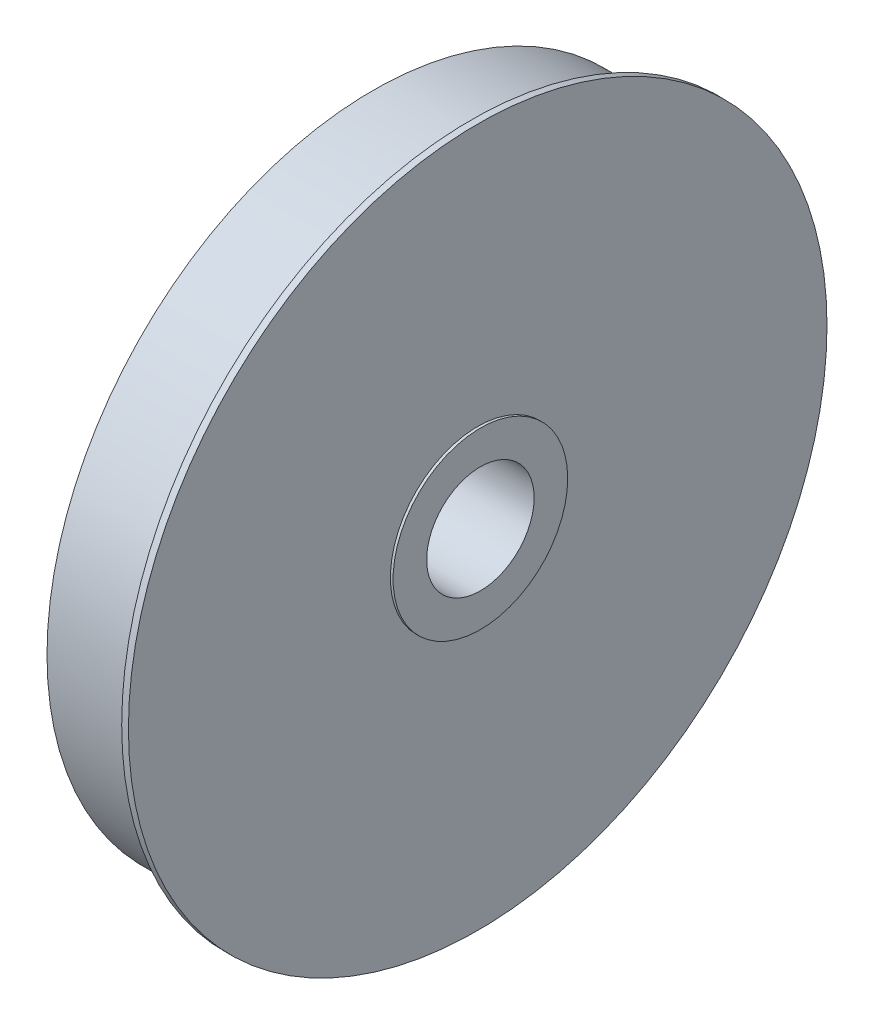
ISO-10303-21;
HEADER;
FILE_DESCRIPTION(('STEP AP214'),'2;1');
FILE_NAME('part.step','',(''),(''),'','','');
FILE_SCHEMA(('AUTOMOTIVE_DESIGN { 1 0 10303 214 1 1 1 1 }'));
ENDSEC;
DATA;
#1=APPLICATION_CONTEXT('core data for automotive mechanical design processes');
#2=APPLICATION_PROTOCOL_DEFINITION('international standard','automotive_design',2000,#1);
#3=PRODUCT_CONTEXT('',#1,'mechanical');
#4=PRODUCT('Part','Part','',(#3));
#5=PRODUCT_RELATED_PRODUCT_CATEGORY('part','',(#4));
#6=PRODUCT_DEFINITION_FORMATION('','',#4);
#7=PRODUCT_DEFINITION_CONTEXT('part definition',#1,'design');
#8=PRODUCT_DEFINITION('design','',#6,#7);
#9=PRODUCT_DEFINITION_SHAPE('','',#8);
#10=(LENGTH_UNIT() NAMED_UNIT(*) SI_UNIT(.MILLI.,.METRE.));
#11=(NAMED_UNIT(*) PLANE_ANGLE_UNIT() SI_UNIT($,.RADIAN.));
#12=(NAMED_UNIT(*) SI_UNIT($,.STERADIAN.) SOLID_ANGLE_UNIT());
#13=UNCERTAINTY_MEASURE_WITH_UNIT(LENGTH_MEASURE(1.E-05),#10,'distance_accuracy_value','');
#14=(GEOMETRIC_REPRESENTATION_CONTEXT(3) GLOBAL_UNCERTAINTY_ASSIGNED_CONTEXT((#13)) GLOBAL_UNIT_ASSIGNED_CONTEXT((#10,
#11,#12)) REPRESENTATION_CONTEXT('',''));
#15=CARTESIAN_POINT('',(0.,0.,0.));
#16=DIRECTION('',(0.,0.,1.));
#17=DIRECTION('',(1.,0.,0.));
#18=AXIS2_PLACEMENT_3D('',#15,#16,#17);
#19=CARTESIAN_POINT('',(8.8,26.,0.));
#20=DIRECTION('',(1.,0.,0.));
#21=DIRECTION('',(0.,0.,-1.));
#22=AXIS2_PLACEMENT_3D('',#19,#20,#21);
#23=PLANE('',#22);
#24=CARTESIAN_POINT('',(8.8,0.,0.));
#25=DIRECTION('',(1.,0.,0.));
#26=DIRECTION('',(0.,0.,-1.));
#27=AXIS2_PLACEMENT_3D('',#24,#25,#26);
#28=CIRCLE('',#27,6.5);
#29=CARTESIAN_POINT('',(8.8,0.,-6.5));
#30=VERTEX_POINT('',#29);
#31=EDGE_CURVE('E10',#30,#30,#28,.T.);
#32=ORIENTED_EDGE('',*,*,#31,.F.);
#33=EDGE_LOOP('',(#32));
#34=FACE_BOUND('',#33,.T.);
#35=CARTESIAN_POINT('',(8.8,0.,0.));
#36=DIRECTION('',(-1.,0.,0.));
#37=DIRECTION('',(0.,0.,1.));
#38=AXIS2_PLACEMENT_3D('',#35,#36,#37);
#39=CIRCLE('',#38,26.);
#40=CARTESIAN_POINT('',(8.8,0.,26.));
#41=VERTEX_POINT('',#40);
#42=EDGE_CURVE('E37',#41,#41,#39,.T.);
#43=ORIENTED_EDGE('',*,*,#42,.F.);
#44=EDGE_LOOP('',(#43));
#45=FACE_BOUND('',#44,.T.);
#46=ADVANCED_FACE('F33',(#34,#45),#23,.T.);
#47=CARTESIAN_POINT('',(0.,0.,0.));
#48=DIRECTION('',(-1.,0.,0.));
#49=DIRECTION('',(0.,0.,1.));
#50=AXIS2_PLACEMENT_3D('',#47,#48,#49);
#51=PLANE('',#50);
#52=CARTESIAN_POINT('',(0.,0.,0.));
#53=DIRECTION('',(-1.,0.,0.));
#54=DIRECTION('',(0.,0.,1.));
#55=AXIS2_PLACEMENT_3D('',#52,#53,#54);
#56=CIRCLE('',#55,20.);
#57=CARTESIAN_POINT('',(0.,0.,20.));
#58=VERTEX_POINT('',#57);
#59=EDGE_CURVE('E55',#58,#58,#56,.T.);
#60=ORIENTED_EDGE('',*,*,#59,.T.);
#61=EDGE_LOOP('',(#60));
#62=FACE_BOUND('',#61,.T.);
#63=CARTESIAN_POINT('',(0.,0.,0.));
#64=DIRECTION('',(1.,0.,0.));
#65=DIRECTION('',(0.,0.,-1.));
#66=AXIS2_PLACEMENT_3D('',#63,#64,#65);
#67=CIRCLE('',#66,3.99999999999999);
#68=CARTESIAN_POINT('',(0.,0.,-3.99999999999999));
#69=VERTEX_POINT('',#68);
#70=EDGE_CURVE('E52',#69,#69,#67,.T.);
#71=ORIENTED_EDGE('',*,*,#70,.T.);
#72=EDGE_LOOP('',(#71));
#73=FACE_BOUND('',#72,.T.);
#74=ADVANCED_FACE('F35',(#62,#73),#51,.T.);
#75=CARTESIAN_POINT('',(-7.95616019814424,0.,0.));
#76=DIRECTION('',(-1.,0.,0.));
#77=DIRECTION('',(0.,0.,1.));
#78=AXIS2_PLACEMENT_3D('',#75,#76,#77);
#79=CYLINDRICAL_SURFACE('',#78,26.);
#80=CARTESIAN_POINT('',(8.3,0.,0.));
#81=DIRECTION('',(-1.,0.,0.));
#82=DIRECTION('',(0.,0.,1.));
#83=AXIS2_PLACEMENT_3D('',#80,#81,#82);
#84=CIRCLE('',#83,26.);
#85=CARTESIAN_POINT('',(8.3,0.,26.));
#86=VERTEX_POINT('',#85);
#87=EDGE_CURVE('E45',#86,#86,#84,.T.);
#88=ORIENTED_EDGE('',*,*,#87,.F.);
#89=EDGE_LOOP('',(#88));
#90=FACE_BOUND('',#89,.T.);
#91=ORIENTED_EDGE('',*,*,#42,.T.);
#92=EDGE_LOOP('',(#91));
#93=FACE_BOUND('',#92,.T.);
#94=ADVANCED_FACE('F75',(#90,#93),#79,.T.);
#95=CARTESIAN_POINT('',(7.8,0.,0.));
#96=DIRECTION('',(1.,0.,0.));
#97=DIRECTION('',(0.,0.,-1.));
#98=AXIS2_PLACEMENT_3D('',#95,#96,#97);
#99=CONICAL_SURFACE('',#98,25.1339745962156,1.0471975511966);
#100=ORIENTED_EDGE('',*,*,#87,.T.);
#101=EDGE_LOOP('',(#100));
#102=FACE_BOUND('',#101,.T.);
#103=CARTESIAN_POINT('',(7.8,0.,0.));
#104=DIRECTION('',(-1.,0.,0.));
#105=DIRECTION('',(0.,0.,1.));
#106=AXIS2_PLACEMENT_3D('',#103,#104,#105);
#107=CIRCLE('',#106,25.1339745962156);
#108=CARTESIAN_POINT('',(7.8,0.,25.1339745962156));
#109=VERTEX_POINT('',#108);
#110=EDGE_CURVE('E67',#109,#109,#107,.T.);
#111=ORIENTED_EDGE('',*,*,#110,.F.);
#112=EDGE_LOOP('',(#111));
#113=FACE_BOUND('',#112,.T.);
#114=ADVANCED_FACE('F72',(#102,#113),#99,.T.);
#115=CARTESIAN_POINT('',(7.8,24.26,0.));
#116=DIRECTION('',(-1.,0.,0.));
#117=DIRECTION('',(0.,0.,1.));
#118=AXIS2_PLACEMENT_3D('',#115,#116,#117);
#119=PLANE('',#118);
#120=ORIENTED_EDGE('',*,*,#110,.T.);
#121=EDGE_LOOP('',(#120));
#122=FACE_BOUND('',#121,.T.);
#123=CARTESIAN_POINT('',(7.8,0.,0.));
#124=DIRECTION('',(-1.,0.,0.));
#125=DIRECTION('',(0.,0.,1.));
#126=AXIS2_PLACEMENT_3D('',#123,#124,#125);
#127=CIRCLE('',#126,24.26);
#128=CARTESIAN_POINT('',(7.8,0.,24.26));
#129=VERTEX_POINT('',#128);
#130=EDGE_CURVE('E64',#129,#129,#127,.T.);
#131=ORIENTED_EDGE('',*,*,#130,.F.);
#132=EDGE_LOOP('',(#131));
#133=FACE_BOUND('',#132,.T.);
#134=ADVANCED_FACE('F90',(#122,#133),#119,.T.);
#135=CARTESIAN_POINT('',(-7.95616019814424,0.,0.));
#136=DIRECTION('',(-1.,0.,0.));
#137=DIRECTION('',(0.,0.,1.));
#138=AXIS2_PLACEMENT_3D('',#135,#136,#137);
#139=CYLINDRICAL_SURFACE('',#138,24.26);
#140=CARTESIAN_POINT('',(1.,0.,0.));
#141=DIRECTION('',(-1.,0.,0.));
#142=DIRECTION('',(0.,0.,1.));
#143=AXIS2_PLACEMENT_3D('',#140,#141,#142);
#144=CIRCLE('',#143,24.26);
#145=CARTESIAN_POINT('',(1.,0.,24.26));
#146=VERTEX_POINT('',#145);
#147=EDGE_CURVE('E61',#146,#146,#144,.T.);
#148=ORIENTED_EDGE('',*,*,#147,.F.);
#149=EDGE_LOOP('',(#148));
#150=FACE_BOUND('',#149,.T.);
#151=ORIENTED_EDGE('',*,*,#130,.T.);
#152=EDGE_LOOP('',(#151));
#153=FACE_BOUND('',#152,.T.);
#154=ADVANCED_FACE('F93',(#150,#153),#139,.T.);
#155=CARTESIAN_POINT('',(1.,20.,0.));
#156=DIRECTION('',(-1.,0.,0.));
#157=DIRECTION('',(0.,0.,1.));
#158=AXIS2_PLACEMENT_3D('',#155,#156,#157);
#159=PLANE('',#158);
#160=ORIENTED_EDGE('',*,*,#147,.T.);
#161=EDGE_LOOP('',(#160));
#162=FACE_BOUND('',#161,.T.);
#163=CARTESIAN_POINT('',(1.,0.,0.));
#164=DIRECTION('',(-1.,0.,0.));
#165=DIRECTION('',(0.,0.,1.));
#166=AXIS2_PLACEMENT_3D('',#163,#164,#165);
#167=CIRCLE('',#166,20.);
#168=CARTESIAN_POINT('',(1.,0.,20.));
#169=VERTEX_POINT('',#168);
#170=EDGE_CURVE('E58',#169,#169,#167,.T.);
#171=ORIENTED_EDGE('',*,*,#170,.F.);
#172=EDGE_LOOP('',(#171));
#173=FACE_BOUND('',#172,.T.);
#174=ADVANCED_FACE('F97',(#162,#173),#159,.T.);
#175=CARTESIAN_POINT('',(-7.95616019814424,0.,0.));
#176=DIRECTION('',(-1.,0.,0.));
#177=DIRECTION('',(0.,0.,1.));
#178=AXIS2_PLACEMENT_3D('',#175,#176,#177);
#179=CYLINDRICAL_SURFACE('',#178,20.);
#180=ORIENTED_EDGE('',*,*,#59,.F.);
#181=EDGE_LOOP('',(#180));
#182=FACE_BOUND('',#181,.T.);
#183=ORIENTED_EDGE('',*,*,#170,.T.);
#184=EDGE_LOOP('',(#183));
#185=FACE_BOUND('',#184,.T.);
#186=ADVANCED_FACE('F101',(#182,#185),#179,.T.);
#187=CARTESIAN_POINT('',(8.8,0.,0.));
#188=DIRECTION('',(1.,0.,0.));
#189=DIRECTION('',(0.,0.,-1.));
#190=AXIS2_PLACEMENT_3D('',#187,#188,#189);
#191=CYLINDRICAL_SURFACE('',#190,3.99999999999999);
#192=ORIENTED_EDGE('',*,*,#70,.F.);
#193=EDGE_LOOP('',(#192));
#194=FACE_BOUND('',#193,.T.);
#195=CARTESIAN_POINT('',(9.,0.,0.));
#196=DIRECTION('',(1.,0.,0.));
#197=DIRECTION('',(0.,0.,-1.));
#198=AXIS2_PLACEMENT_3D('',#195,#196,#197);
#199=CIRCLE('',#198,3.99999999999999);
#200=CARTESIAN_POINT('',(9.,0.,-3.99999999999999));
#201=VERTEX_POINT('',#200);
#202=EDGE_CURVE('E48',#201,#201,#199,.T.);
#203=ORIENTED_EDGE('',*,*,#202,.T.);
#204=EDGE_LOOP('',(#203));
#205=FACE_BOUND('',#204,.T.);
#206=ADVANCED_FACE('F105',(#194,#205),#191,.F.);
#207=CARTESIAN_POINT('',(9.,0.,0.));
#208=DIRECTION('',(1.,0.,0.));
#209=DIRECTION('',(0.,0.,-1.));
#210=AXIS2_PLACEMENT_3D('',#207,#208,#209);
#211=PLANE('',#210);
#212=CARTESIAN_POINT('',(9.,0.,0.));
#213=DIRECTION('',(1.,0.,0.));
#214=DIRECTION('',(0.,0.,-1.));
#215=AXIS2_PLACEMENT_3D('',#212,#213,#214);
#216=CIRCLE('',#215,6.5);
#217=CARTESIAN_POINT('',(9.,0.,-6.5));
#218=VERTEX_POINT('',#217);
#219=EDGE_CURVE('E49',#218,#218,#216,.T.);
#220=ORIENTED_EDGE('',*,*,#219,.T.);
#221=EDGE_LOOP('',(#220));
#222=FACE_BOUND('',#221,.T.);
#223=ORIENTED_EDGE('',*,*,#202,.F.);
#224=EDGE_LOOP('',(#223));
#225=FACE_BOUND('',#224,.T.);
#226=ADVANCED_FACE('F109',(#222,#225),#211,.T.);
#227=CARTESIAN_POINT('',(9.,0.,0.));
#228=DIRECTION('',(-1.,0.,0.));
#229=DIRECTION('',(0.,0.,1.));
#230=AXIS2_PLACEMENT_3D('',#227,#228,#229);
#231=CYLINDRICAL_SURFACE('',#230,6.5);
#232=ORIENTED_EDGE('',*,*,#219,.F.);
#233=EDGE_LOOP('',(#232));
#234=FACE_BOUND('',#233,.T.);
#235=ORIENTED_EDGE('',*,*,#31,.T.);
#236=EDGE_LOOP('',(#235));
#237=FACE_BOUND('',#236,.T.);
#238=ADVANCED_FACE('F111',(#234,#237),#231,.T.);
#239=CLOSED_SHELL('',(#46,#74,#94,#114,#134,#154,#174,#186,#206,#226,#238));
#240=MANIFOLD_SOLID_BREP('B2',#239);
#241=ADVANCED_BREP_SHAPE_REPRESENTATION('',(#18,#240),#14);
#242=SHAPE_DEFINITION_REPRESENTATION(#9,#241);
ENDSEC;
END-ISO-10303-21;
